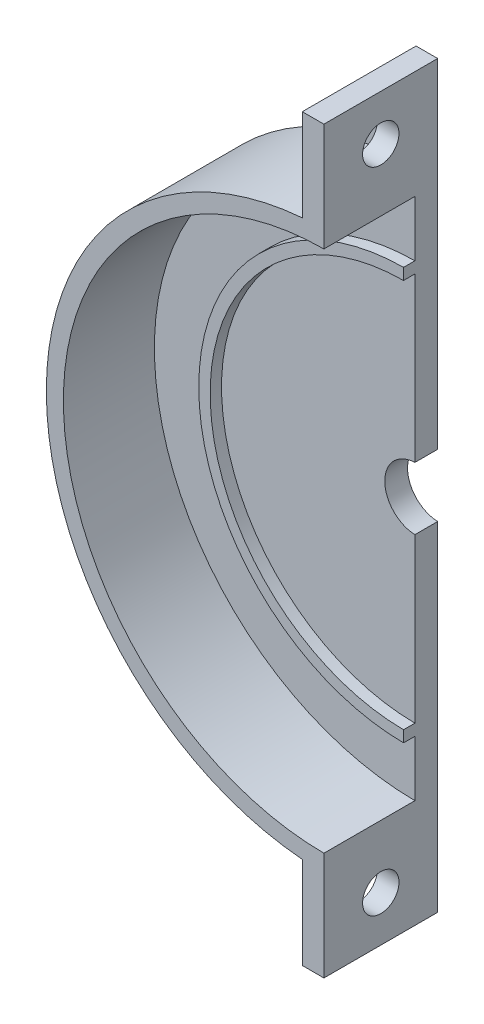
ISO-10303-21;
HEADER;
FILE_DESCRIPTION(('STEP AP214'),'2;1');
FILE_NAME('part.step','',(''),(''),'','','');
FILE_SCHEMA(('AUTOMOTIVE_DESIGN { 1 0 10303 214 1 1 1 1 }'));
ENDSEC;
DATA;
#1=APPLICATION_CONTEXT('core data for automotive mechanical design processes');
#2=APPLICATION_PROTOCOL_DEFINITION('international standard','automotive_design',2000,#1);
#3=PRODUCT_CONTEXT('',#1,'mechanical');
#4=PRODUCT('Part','Part','',(#3));
#5=PRODUCT_RELATED_PRODUCT_CATEGORY('part','',(#4));
#6=PRODUCT_DEFINITION_FORMATION('','',#4);
#7=PRODUCT_DEFINITION_CONTEXT('part definition',#1,'design');
#8=PRODUCT_DEFINITION('design','',#6,#7);
#9=PRODUCT_DEFINITION_SHAPE('','',#8);
#10=(LENGTH_UNIT() NAMED_UNIT(*) SI_UNIT(.MILLI.,.METRE.));
#11=(NAMED_UNIT(*) PLANE_ANGLE_UNIT() SI_UNIT($,.RADIAN.));
#12=(NAMED_UNIT(*) SI_UNIT($,.STERADIAN.) SOLID_ANGLE_UNIT());
#13=UNCERTAINTY_MEASURE_WITH_UNIT(LENGTH_MEASURE(1.E-05),#10,'distance_accuracy_value','');
#14=(GEOMETRIC_REPRESENTATION_CONTEXT(3) GLOBAL_UNCERTAINTY_ASSIGNED_CONTEXT((#13)) GLOBAL_UNIT_ASSIGNED_CONTEXT((#10,
#11,#12)) REPRESENTATION_CONTEXT('',''));
#15=CARTESIAN_POINT('',(0.,0.,0.));
#16=DIRECTION('',(0.,0.,1.));
#17=DIRECTION('',(1.,0.,0.));
#18=AXIS2_PLACEMENT_3D('',#15,#16,#17);
#19=CARTESIAN_POINT('',(0.,0.,2.));
#20=DIRECTION('',(0.,0.,1.));
#21=DIRECTION('',(1.,0.,0.));
#22=AXIS2_PLACEMENT_3D('',#19,#20,#21);
#23=PLANE('',#22);
#24=DIRECTION('',(0.,1.,0.));
#25=VECTOR('',#24,1.);
#26=CARTESIAN_POINT('',(-0.0999999999999945,23.,2.));
#27=LINE('',#26,#25);
#28=CARTESIAN_POINT('',(-0.1,2.74818121673226,2.));
#29=VERTEX_POINT('',#28);
#30=CARTESIAN_POINT('',(-0.0999999999999961,17.0997075998392,2.));
#31=VERTEX_POINT('',#30);
#32=EDGE_CURVE('E261',#29,#31,#27,.T.);
#33=ORIENTED_EDGE('',*,*,#32,.T.);
#34=CARTESIAN_POINT('',(0.,0.,2.));
#35=DIRECTION('',(0.,0.,-1.));
#36=DIRECTION('',(1.,0.,0.));
#37=AXIS2_PLACEMENT_3D('',#34,#35,#36);
#38=CIRCLE('',#37,17.1);
#39=CARTESIAN_POINT('',(-0.0999999999999961,-17.0997075998392,2.));
#40=VERTEX_POINT('',#39);
#41=EDGE_CURVE('E181',#40,#31,#38,.T.);
#42=ORIENTED_EDGE('',*,*,#41,.F.);
#43=DIRECTION('',(0.,1.,0.));
#44=VECTOR('',#43,1.);
#45=CARTESIAN_POINT('',(-0.1,-2.65,2.));
#46=LINE('',#45,#44);
#47=CARTESIAN_POINT('',(-0.1,-2.74818121673226,2.));
#48=VERTEX_POINT('',#47);
#49=EDGE_CURVE('E260',#40,#48,#46,.T.);
#50=ORIENTED_EDGE('',*,*,#49,.T.);
#51=CARTESIAN_POINT('',(0.,0.,2.));
#52=DIRECTION('',(0.,0.,1.));
#53=DIRECTION('',(1.,0.,0.));
#54=AXIS2_PLACEMENT_3D('',#51,#52,#53);
#55=CIRCLE('',#54,2.75);
#56=EDGE_CURVE('E275',#48,#29,#55,.F.);
#57=ORIENTED_EDGE('',*,*,#56,.T.);
#58=EDGE_LOOP('',(#33,#42,#50,#57));
#59=FACE_BOUND('',#58,.T.);
#60=ADVANCED_FACE('F40',(#59),#23,.T.);
#61=CARTESIAN_POINT('',(-0.0999999999999945,-22.9997826076683,2.));
#62=VERTEX_POINT('',#61);
#63=CARTESIAN_POINT('',(-0.0999999999999958,-18.099723754798,2.));
#64=VERTEX_POINT('',#63);
#65=EDGE_CURVE('E57',#62,#64,#46,.T.);
#66=ORIENTED_EDGE('',*,*,#65,.T.);
#67=CARTESIAN_POINT('',(0.,0.,2.));
#68=DIRECTION('',(0.,0.,1.));
#69=DIRECTION('',(1.,0.,0.));
#70=AXIS2_PLACEMENT_3D('',#67,#68,#69);
#71=CIRCLE('',#70,18.1);
#72=CARTESIAN_POINT('',(-0.0999999999999958,18.099723754798,2.));
#73=VERTEX_POINT('',#72);
#74=EDGE_CURVE('E61',#73,#64,#71,.T.);
#75=ORIENTED_EDGE('',*,*,#74,.F.);
#76=CARTESIAN_POINT('',(-0.0999999999999945,22.9997826076683,2.));
#77=VERTEX_POINT('',#76);
#78=EDGE_CURVE('E285',#73,#77,#27,.T.);
#79=ORIENTED_EDGE('',*,*,#78,.T.);
#80=CARTESIAN_POINT('',(0.,0.,2.));
#81=DIRECTION('',(0.,0.,1.));
#82=DIRECTION('',(1.,0.,0.));
#83=AXIS2_PLACEMENT_3D('',#80,#81,#82);
#84=CIRCLE('',#83,23.);
#85=EDGE_CURVE('E258',#77,#62,#84,.T.);
#86=ORIENTED_EDGE('',*,*,#85,.T.);
#87=EDGE_LOOP('',(#66,#75,#79,#86));
#88=FACE_BOUND('',#87,.T.);
#89=ADVANCED_FACE('F367',(#88),#23,.T.);
#90=CARTESIAN_POINT('',(0.,0.,10.));
#91=DIRECTION('',(0.,0.,-1.));
#92=DIRECTION('',(-1.,0.,0.));
#93=AXIS2_PLACEMENT_3D('',#90,#91,#92);
#94=CYLINDRICAL_SURFACE('',#93,24.5);
#95=DIRECTION('',(0.,0.,-1.));
#96=VECTOR('',#95,1.);
#97=CARTESIAN_POINT('',(-9.12404728203419,22.7376727304094,1.));
#98=LINE('',#97,#96);
#99=CARTESIAN_POINT('',(-9.12404728203419,22.7376727304094,1.));
#100=VERTEX_POINT('',#99);
#101=CARTESIAN_POINT('',(-9.12404728203419,22.7376727304094,0.));
#102=VERTEX_POINT('',#101);
#103=EDGE_CURVE('E193',#100,#102,#98,.T.);
#104=ORIENTED_EDGE('',*,*,#103,.T.);
#105=CARTESIAN_POINT('',(0.,0.,0.));
#106=DIRECTION('',(0.,0.,1.));
#107=DIRECTION('',(-1.,0.,0.));
#108=AXIS2_PLACEMENT_3D('',#105,#106,#107);
#109=CIRCLE('',#108,24.5);
#110=CARTESIAN_POINT('',(-9.12404728203419,-22.7376727304094,0.));
#111=VERTEX_POINT('',#110);
#112=EDGE_CURVE('E250',#102,#111,#109,.T.);
#113=ORIENTED_EDGE('',*,*,#112,.T.);
#114=DIRECTION('',(0.,0.,-1.));
#115=VECTOR('',#114,1.);
#116=CARTESIAN_POINT('',(-9.12404728203419,-22.7376727304094,1.));
#117=LINE('',#116,#115);
#118=CARTESIAN_POINT('',(-9.12404728203419,-22.7376727304094,0.999999999999999));
#119=VERTEX_POINT('',#118);
#120=EDGE_CURVE('E224',#119,#111,#117,.T.);
#121=ORIENTED_EDGE('',*,*,#120,.F.);
#122=CARTESIAN_POINT('',(0.,0.,0.999999999999999));
#123=DIRECTION('',(0.,0.,1.));
#124=DIRECTION('',(1.,0.,0.));
#125=AXIS2_PLACEMENT_3D('',#122,#123,#124);
#126=CIRCLE('',#125,24.5);
#127=CARTESIAN_POINT('',(-2.,-24.4182308941496,0.999999999999999));
#128=VERTEX_POINT('',#127);
#129=EDGE_CURVE('E229',#119,#128,#126,.T.);
#130=ORIENTED_EDGE('',*,*,#129,.T.);
#131=DIRECTION('',(0.,0.,-1.));
#132=VECTOR('',#131,1.);
#133=CARTESIAN_POINT('',(-2.,-24.4182308941496,10.));
#134=LINE('',#133,#132);
#135=CARTESIAN_POINT('',(-2.,-24.4182308941496,10.));
#136=VERTEX_POINT('',#135);
#137=EDGE_CURVE('E247',#128,#136,#134,.F.);
#138=ORIENTED_EDGE('',*,*,#137,.T.);
#139=CARTESIAN_POINT('',(0.,0.,10.));
#140=DIRECTION('',(0.,0.,1.));
#141=DIRECTION('',(-1.,0.,0.));
#142=AXIS2_PLACEMENT_3D('',#139,#140,#141);
#143=CIRCLE('',#142,24.5);
#144=CARTESIAN_POINT('',(-2.,24.4182308941496,10.));
#145=VERTEX_POINT('',#144);
#146=EDGE_CURVE('E251',#145,#136,#143,.T.);
#147=ORIENTED_EDGE('',*,*,#146,.F.);
#148=DIRECTION('',(0.,0.,-1.));
#149=VECTOR('',#148,1.);
#150=CARTESIAN_POINT('',(-2.,24.4182308941496,10.));
#151=LINE('',#150,#149);
#152=CARTESIAN_POINT('',(-2.,24.4182308941496,1.));
#153=VERTEX_POINT('',#152);
#154=EDGE_CURVE('E214',#153,#145,#151,.F.);
#155=ORIENTED_EDGE('',*,*,#154,.F.);
#156=CARTESIAN_POINT('',(0.,0.,0.999999999999999));
#157=DIRECTION('',(0.,0.,1.));
#158=DIRECTION('',(1.,0.,0.));
#159=AXIS2_PLACEMENT_3D('',#156,#157,#158);
#160=CIRCLE('',#159,24.5);
#161=EDGE_CURVE('E197',#153,#100,#160,.T.);
#162=ORIENTED_EDGE('',*,*,#161,.T.);
#163=EDGE_LOOP('',(#104,#113,#121,#130,#138,#147,#155,#162));
#164=FACE_BOUND('',#163,.T.);
#165=ADVANCED_FACE('F343',(#164),#94,.T.);
#166=CARTESIAN_POINT('',(0.,0.,2.));
#167=DIRECTION('',(0.,0.,-1.));
#168=DIRECTION('',(-1.,0.,0.));
#169=AXIS2_PLACEMENT_3D('',#166,#167,#168);
#170=CYLINDRICAL_SURFACE('',#169,2.75);
#171=CARTESIAN_POINT('',(0.,0.,0.));
#172=DIRECTION('',(0.,0.,1.));
#173=DIRECTION('',(1.,0.,0.));
#174=AXIS2_PLACEMENT_3D('',#171,#172,#173);
#175=CIRCLE('',#174,2.75);
#176=CARTESIAN_POINT('',(-0.1,-2.74818121673226,0.));
#177=VERTEX_POINT('',#176);
#178=CARTESIAN_POINT('',(-0.1,2.74818121673226,0.));
#179=VERTEX_POINT('',#178);
#180=EDGE_CURVE('E268',#177,#179,#175,.F.);
#181=ORIENTED_EDGE('',*,*,#180,.T.);
#182=DIRECTION('',(0.,0.,-1.));
#183=VECTOR('',#182,1.);
#184=CARTESIAN_POINT('',(-0.1,2.74818121673226,2.));
#185=LINE('',#184,#183);
#186=EDGE_CURVE('E12',#29,#179,#185,.T.);
#187=ORIENTED_EDGE('',*,*,#186,.F.);
#188=ORIENTED_EDGE('',*,*,#56,.F.);
#189=DIRECTION('',(0.,0.,-1.));
#190=VECTOR('',#189,1.);
#191=CARTESIAN_POINT('',(-0.1,-2.74818121673226,2.));
#192=LINE('',#191,#190);
#193=EDGE_CURVE('E49',#48,#177,#192,.T.);
#194=ORIENTED_EDGE('',*,*,#193,.T.);
#195=EDGE_LOOP('',(#181,#187,#188,#194));
#196=FACE_BOUND('',#195,.T.);
#197=ADVANCED_FACE('F308',(#196),#170,.F.);
#198=CARTESIAN_POINT('',(-0.0999999999999945,23.,2.));
#199=DIRECTION('',(-1.,0.,0.));
#200=DIRECTION('',(0.,-1.,0.));
#201=AXIS2_PLACEMENT_3D('',#198,#199,#200);
#202=PLANE('',#201);
#203=CARTESIAN_POINT('',(-0.0999999999999925,28.5,5.));
#204=DIRECTION('',(-1.,0.,0.));
#205=DIRECTION('',(0.,-1.,0.));
#206=AXIS2_PLACEMENT_3D('',#203,#204,#205);
#207=CIRCLE('',#206,1.6);
#208=CARTESIAN_POINT('',(-0.0999999999999929,26.9,5.));
#209=VERTEX_POINT('',#208);
#210=EDGE_CURVE('E44',#209,#209,#207,.T.);
#211=ORIENTED_EDGE('',*,*,#210,.T.);
#212=EDGE_LOOP('',(#211));
#213=FACE_BOUND('',#212,.T.);
#214=DIRECTION('',(0.,1.,0.));
#215=VECTOR('',#214,1.);
#216=CARTESIAN_POINT('',(-0.0999999999999945,23.,0.));
#217=LINE('',#216,#215);
#218=CARTESIAN_POINT('',(-0.0999999999999919,32.5,0.));
#219=VERTEX_POINT('',#218);
#220=EDGE_CURVE('E271',#179,#219,#217,.T.);
#221=ORIENTED_EDGE('',*,*,#220,.T.);
#222=DIRECTION('',(0.,0.,1.));
#223=VECTOR('',#222,1.);
#224=CARTESIAN_POINT('',(-0.0999999999999919,32.5,2.));
#225=LINE('',#224,#223);
#226=CARTESIAN_POINT('',(-0.0999999999999919,32.5,10.));
#227=VERTEX_POINT('',#226);
#228=EDGE_CURVE('E203',#219,#227,#225,.T.);
#229=ORIENTED_EDGE('',*,*,#228,.T.);
#230=DIRECTION('',(0.,1.,0.));
#231=VECTOR('',#230,1.);
#232=CARTESIAN_POINT('',(-0.100000000000001,0.,10.));
#233=LINE('',#232,#231);
#234=CARTESIAN_POINT('',(-0.0999999999999945,22.9997826076683,10.));
#235=VERTEX_POINT('',#234);
#236=EDGE_CURVE('E256',#235,#227,#233,.T.);
#237=ORIENTED_EDGE('',*,*,#236,.F.);
#238=DIRECTION('',(0.,0.,-1.));
#239=VECTOR('',#238,1.);
#240=CARTESIAN_POINT('',(-0.0999999999999945,22.9997826076683,10.));
#241=LINE('',#240,#239);
#242=EDGE_CURVE('E281',#235,#77,#241,.T.);
#243=ORIENTED_EDGE('',*,*,#242,.T.);
#244=ORIENTED_EDGE('',*,*,#78,.F.);
#245=DIRECTION('',(0.,0.,-1.));
#246=VECTOR('',#245,1.);
#247=CARTESIAN_POINT('',(-0.099999999999995,18.099723754798,3.));
#248=LINE('',#247,#246);
#249=CARTESIAN_POINT('',(-0.099999999999995,18.099723754798,3.));
#250=VERTEX_POINT('',#249);
#251=EDGE_CURVE('E165',#250,#73,#248,.T.);
#252=ORIENTED_EDGE('',*,*,#251,.F.);
#253=DIRECTION('',(0.,1.,0.));
#254=VECTOR('',#253,1.);
#255=CARTESIAN_POINT('',(-0.0999999999999961,17.0997075998392,3.));
#256=LINE('',#255,#254);
#257=CARTESIAN_POINT('',(-0.0999999999999961,17.0997075998392,3.));
#258=VERTEX_POINT('',#257);
#259=EDGE_CURVE('E159',#258,#250,#256,.T.);
#260=ORIENTED_EDGE('',*,*,#259,.F.);
#261=DIRECTION('',(0.,0.,-1.));
#262=VECTOR('',#261,1.);
#263=CARTESIAN_POINT('',(-0.0999999999999961,17.0997075998392,3.));
#264=LINE('',#263,#262);
#265=EDGE_CURVE('E162',#258,#31,#264,.T.);
#266=ORIENTED_EDGE('',*,*,#265,.T.);
#267=ORIENTED_EDGE('',*,*,#32,.F.);
#268=ORIENTED_EDGE('',*,*,#186,.T.);
#269=EDGE_LOOP('',(#221,#229,#237,#243,#244,#252,#260,#266,#267,#268));
#270=FACE_BOUND('',#269,.T.);
#271=ADVANCED_FACE('F42',(#213,#270),#202,.F.);
#272=CARTESIAN_POINT('',(-0.1,-2.65,2.));
#273=DIRECTION('',(-1.,0.,0.));
#274=DIRECTION('',(0.,-1.,0.));
#275=AXIS2_PLACEMENT_3D('',#272,#273,#274);
#276=PLANE('',#275);
#277=CARTESIAN_POINT('',(-0.0999999999999925,-28.5,5.));
#278=DIRECTION('',(-1.,0.,0.));
#279=DIRECTION('',(0.,-1.,0.));
#280=AXIS2_PLACEMENT_3D('',#277,#278,#279);
#281=CIRCLE('',#280,1.6);
#282=CARTESIAN_POINT('',(-0.099999999999992,-30.1,5.));
#283=VERTEX_POINT('',#282);
#284=EDGE_CURVE('E231',#283,#283,#281,.F.);
#285=ORIENTED_EDGE('',*,*,#284,.F.);
#286=EDGE_LOOP('',(#285));
#287=FACE_BOUND('',#286,.T.);
#288=DIRECTION('',(0.,1.,0.));
#289=VECTOR('',#288,1.);
#290=CARTESIAN_POINT('',(-0.1,-2.65,0.));
#291=LINE('',#290,#289);
#292=CARTESIAN_POINT('',(-0.0999999999999919,-32.5,0.));
#293=VERTEX_POINT('',#292);
#294=EDGE_CURVE('E273',#293,#177,#291,.T.);
#295=ORIENTED_EDGE('',*,*,#294,.T.);
#296=ORIENTED_EDGE('',*,*,#193,.F.);
#297=ORIENTED_EDGE('',*,*,#49,.F.);
#298=DIRECTION('',(0.,0.,-1.));
#299=VECTOR('',#298,1.);
#300=CARTESIAN_POINT('',(-0.0999999999999961,-17.0997075998392,3.));
#301=LINE('',#300,#299);
#302=CARTESIAN_POINT('',(-0.0999999999999961,-17.0997075998392,3.));
#303=VERTEX_POINT('',#302);
#304=EDGE_CURVE('E314',#303,#40,#301,.T.);
#305=ORIENTED_EDGE('',*,*,#304,.F.);
#306=DIRECTION('',(0.,1.,0.));
#307=VECTOR('',#306,1.);
#308=CARTESIAN_POINT('',(-0.0999999999999961,-17.0997075998392,3.));
#309=LINE('',#308,#307);
#310=CARTESIAN_POINT('',(-0.0999999999999958,-18.099723754798,3.));
#311=VERTEX_POINT('',#310);
#312=EDGE_CURVE('E174',#311,#303,#309,.T.);
#313=ORIENTED_EDGE('',*,*,#312,.F.);
#314=DIRECTION('',(0.,0.,-1.));
#315=VECTOR('',#314,1.);
#316=CARTESIAN_POINT('',(-0.0999999999999958,-18.099723754798,3.));
#317=LINE('',#316,#315);
#318=EDGE_CURVE('E186',#311,#64,#317,.T.);
#319=ORIENTED_EDGE('',*,*,#318,.T.);
#320=ORIENTED_EDGE('',*,*,#65,.F.);
#321=DIRECTION('',(0.,0.,-1.));
#322=VECTOR('',#321,1.);
#323=CARTESIAN_POINT('',(-0.0999999999999945,-22.9997826076683,10.));
#324=LINE('',#323,#322);
#325=CARTESIAN_POINT('',(-0.0999999999999945,-22.9997826076683,10.));
#326=VERTEX_POINT('',#325);
#327=EDGE_CURVE('E272',#326,#62,#324,.T.);
#328=ORIENTED_EDGE('',*,*,#327,.F.);
#329=DIRECTION('',(0.,1.,0.));
#330=VECTOR('',#329,1.);
#331=CARTESIAN_POINT('',(-0.100000000000001,0.,10.));
#332=LINE('',#331,#330);
#333=CARTESIAN_POINT('',(-0.0999999999999919,-32.5,10.));
#334=VERTEX_POINT('',#333);
#335=EDGE_CURVE('E253',#334,#326,#332,.T.);
#336=ORIENTED_EDGE('',*,*,#335,.F.);
#337=DIRECTION('',(0.,0.,1.));
#338=VECTOR('',#337,1.);
#339=CARTESIAN_POINT('',(-0.0999999999999919,-32.5,2.));
#340=LINE('',#339,#338);
#341=EDGE_CURVE('E246',#293,#334,#340,.T.);
#342=ORIENTED_EDGE('',*,*,#341,.F.);
#343=EDGE_LOOP('',(#295,#296,#297,#305,#313,#319,#320,#328,#336,#342));
#344=FACE_BOUND('',#343,.T.);
#345=ADVANCED_FACE('F297',(#287,#344),#276,.F.);
#346=CARTESIAN_POINT('',(0.,0.,0.));
#347=DIRECTION('',(0.,0.,1.));
#348=DIRECTION('',(1.,0.,0.));
#349=AXIS2_PLACEMENT_3D('',#346,#347,#348);
#350=PLANE('',#349);
#351=ORIENTED_EDGE('',*,*,#112,.F.);
#352=DIRECTION('',(-0.589479158227283,-0.807783586126664,0.));
#353=VECTOR('',#352,1.);
#354=CARTESIAN_POINT('',(-2.,32.5,0.));
#355=LINE('',#354,#353);
#356=CARTESIAN_POINT('',(-2.,32.5,0.));
#357=VERTEX_POINT('',#356);
#358=EDGE_CURVE('E182',#357,#102,#355,.T.);
#359=ORIENTED_EDGE('',*,*,#358,.F.);
#360=DIRECTION('',(1.,0.,0.));
#361=VECTOR('',#360,1.);
#362=CARTESIAN_POINT('',(0.,32.5,0.));
#363=LINE('',#362,#361);
#364=EDGE_CURVE('E200',#357,#219,#363,.T.);
#365=ORIENTED_EDGE('',*,*,#364,.T.);
#366=ORIENTED_EDGE('',*,*,#220,.F.);
#367=ORIENTED_EDGE('',*,*,#180,.F.);
#368=ORIENTED_EDGE('',*,*,#294,.F.);
#369=DIRECTION('',(1.,0.,0.));
#370=VECTOR('',#369,1.);
#371=CARTESIAN_POINT('',(0.,-32.5,0.));
#372=LINE('',#371,#370);
#373=CARTESIAN_POINT('',(-2.,-32.5,0.));
#374=VERTEX_POINT('',#373);
#375=EDGE_CURVE('E232',#374,#293,#372,.T.);
#376=ORIENTED_EDGE('',*,*,#375,.F.);
#377=DIRECTION('',(-0.589479158227283,0.807783586126664,0.));
#378=VECTOR('',#377,1.);
#379=CARTESIAN_POINT('',(-2.,-32.5,0.));
#380=LINE('',#379,#378);
#381=EDGE_CURVE('E217',#374,#111,#380,.T.);
#382=ORIENTED_EDGE('',*,*,#381,.T.);
#383=EDGE_LOOP('',(#351,#359,#365,#366,#367,#368,#376,#382));
#384=FACE_BOUND('',#383,.T.);
#385=ADVANCED_FACE('F300',(#384),#350,.F.);
#386=CARTESIAN_POINT('',(0.,0.,10.));
#387=DIRECTION('',(0.,0.,-1.));
#388=DIRECTION('',(-1.,0.,0.));
#389=AXIS2_PLACEMENT_3D('',#386,#387,#388);
#390=CYLINDRICAL_SURFACE('',#389,23.);
#391=ORIENTED_EDGE('',*,*,#85,.F.);
#392=ORIENTED_EDGE('',*,*,#242,.F.);
#393=CARTESIAN_POINT('',(0.,0.,10.));
#394=DIRECTION('',(0.,0.,-1.));
#395=DIRECTION('',(-1.,0.,0.));
#396=AXIS2_PLACEMENT_3D('',#393,#394,#395);
#397=CIRCLE('',#396,23.);
#398=EDGE_CURVE('E254',#326,#235,#397,.T.);
#399=ORIENTED_EDGE('',*,*,#398,.F.);
#400=ORIENTED_EDGE('',*,*,#327,.T.);
#401=EDGE_LOOP('',(#391,#392,#399,#400));
#402=FACE_BOUND('',#401,.T.);
#403=ADVANCED_FACE('F328',(#402),#390,.F.);
#404=CARTESIAN_POINT('',(0.,0.,10.));
#405=DIRECTION('',(0.,0.,-1.));
#406=DIRECTION('',(-1.,0.,0.));
#407=AXIS2_PLACEMENT_3D('',#404,#405,#406);
#408=PLANE('',#407);
#409=ORIENTED_EDGE('',*,*,#236,.T.);
#410=DIRECTION('',(1.,0.,0.));
#411=VECTOR('',#410,1.);
#412=CARTESIAN_POINT('',(0.,32.5,10.));
#413=LINE('',#412,#411);
#414=CARTESIAN_POINT('',(-2.,32.5,10.));
#415=VERTEX_POINT('',#414);
#416=EDGE_CURVE('E205',#415,#227,#413,.T.);
#417=ORIENTED_EDGE('',*,*,#416,.F.);
#418=DIRECTION('',(0.,1.,0.));
#419=VECTOR('',#418,1.);
#420=CARTESIAN_POINT('',(-2.,23.2084428476753,10.));
#421=LINE('',#420,#419);
#422=EDGE_CURVE('E204',#145,#415,#421,.T.);
#423=ORIENTED_EDGE('',*,*,#422,.F.);
#424=ORIENTED_EDGE('',*,*,#146,.T.);
#425=DIRECTION('',(0.,-1.,0.));
#426=VECTOR('',#425,1.);
#427=CARTESIAN_POINT('',(-2.,-23.2084428476753,10.));
#428=LINE('',#427,#426);
#429=CARTESIAN_POINT('',(-2.,-32.5,10.));
#430=VERTEX_POINT('',#429);
#431=EDGE_CURVE('E237',#136,#430,#428,.T.);
#432=ORIENTED_EDGE('',*,*,#431,.T.);
#433=DIRECTION('',(1.,0.,0.));
#434=VECTOR('',#433,1.);
#435=CARTESIAN_POINT('',(0.,-32.5,10.));
#436=LINE('',#435,#434);
#437=EDGE_CURVE('E236',#430,#334,#436,.T.);
#438=ORIENTED_EDGE('',*,*,#437,.T.);
#439=ORIENTED_EDGE('',*,*,#335,.T.);
#440=ORIENTED_EDGE('',*,*,#398,.T.);
#441=EDGE_LOOP('',(#409,#417,#423,#424,#432,#438,#439,#440));
#442=FACE_BOUND('',#441,.T.);
#443=ADVANCED_FACE('F332',(#442),#408,.F.);
#444=CARTESIAN_POINT('',(-2.,-23.2084428476753,0.));
#445=DIRECTION('',(-1.,0.,0.));
#446=DIRECTION('',(0.,-1.,0.));
#447=AXIS2_PLACEMENT_3D('',#444,#445,#446);
#448=PLANE('',#447);
#449=DIRECTION('',(0.,-1.,0.));
#450=VECTOR('',#449,1.);
#451=CARTESIAN_POINT('',(-2.,-22.7376727304094,1.));
#452=LINE('',#451,#450);
#453=CARTESIAN_POINT('',(-2.,-32.5,1.));
#454=VERTEX_POINT('',#453);
#455=EDGE_CURVE('E218',#128,#454,#452,.T.);
#456=ORIENTED_EDGE('',*,*,#455,.T.);
#457=DIRECTION('',(0.,0.,1.));
#458=VECTOR('',#457,1.);
#459=CARTESIAN_POINT('',(-2.,-32.5,0.));
#460=LINE('',#459,#458);
#461=EDGE_CURVE('E235',#454,#430,#460,.T.);
#462=ORIENTED_EDGE('',*,*,#461,.T.);
#463=ORIENTED_EDGE('',*,*,#431,.F.);
#464=ORIENTED_EDGE('',*,*,#137,.F.);
#465=EDGE_LOOP('',(#456,#462,#463,#464));
#466=FACE_BOUND('',#465,.T.);
#467=CARTESIAN_POINT('',(-2.,-28.5,5.));
#468=DIRECTION('',(-1.,0.,0.));
#469=DIRECTION('',(0.,-1.,0.));
#470=AXIS2_PLACEMENT_3D('',#467,#468,#469);
#471=CIRCLE('',#470,1.6);
#472=CARTESIAN_POINT('',(-2.,-30.1,5.));
#473=VERTEX_POINT('',#472);
#474=EDGE_CURVE('E240',#473,#473,#471,.T.);
#475=ORIENTED_EDGE('',*,*,#474,.F.);
#476=EDGE_LOOP('',(#475));
#477=FACE_BOUND('',#476,.T.);
#478=ADVANCED_FACE('F349',(#466,#477),#448,.T.);
#479=CARTESIAN_POINT('',(0.,-32.5,0.));
#480=DIRECTION('',(0.,-1.,0.));
#481=DIRECTION('',(0.,0.,-1.));
#482=AXIS2_PLACEMENT_3D('',#479,#480,#481);
#483=PLANE('',#482);
#484=ORIENTED_EDGE('',*,*,#437,.F.);
#485=ORIENTED_EDGE('',*,*,#461,.F.);
#486=EDGE_CURVE('E243',#374,#454,#460,.T.);
#487=ORIENTED_EDGE('',*,*,#486,.F.);
#488=ORIENTED_EDGE('',*,*,#375,.T.);
#489=ORIENTED_EDGE('',*,*,#341,.T.);
#490=EDGE_LOOP('',(#484,#485,#487,#488,#489));
#491=FACE_BOUND('',#490,.T.);
#492=ADVANCED_FACE('F336',(#491),#483,.T.);
#493=CARTESIAN_POINT('',(-9.99999999999999,-28.5,5.));
#494=DIRECTION('',(1.,0.,0.));
#495=DIRECTION('',(0.,1.,0.));
#496=AXIS2_PLACEMENT_3D('',#493,#494,#495);
#497=CYLINDRICAL_SURFACE('',#496,1.6);
#498=ORIENTED_EDGE('',*,*,#474,.T.);
#499=EDGE_LOOP('',(#498));
#500=FACE_BOUND('',#499,.T.);
#501=ORIENTED_EDGE('',*,*,#284,.T.);
#502=EDGE_LOOP('',(#501));
#503=FACE_BOUND('',#502,.T.);
#504=ADVANCED_FACE('F295',(#500,#503),#497,.F.);
#505=CARTESIAN_POINT('',(0.,0.,1.));
#506=DIRECTION('',(0.,0.,1.));
#507=DIRECTION('',(1.,0.,0.));
#508=AXIS2_PLACEMENT_3D('',#505,#506,#507);
#509=PLANE('',#508);
#510=ORIENTED_EDGE('',*,*,#129,.F.);
#511=DIRECTION('',(-0.589479158227283,0.807783586126664,0.));
#512=VECTOR('',#511,1.);
#513=CARTESIAN_POINT('',(-2.,-32.5,1.));
#514=LINE('',#513,#512);
#515=EDGE_CURVE('E221',#454,#119,#514,.T.);
#516=ORIENTED_EDGE('',*,*,#515,.F.);
#517=ORIENTED_EDGE('',*,*,#455,.F.);
#518=EDGE_LOOP('',(#510,#516,#517));
#519=FACE_BOUND('',#518,.T.);
#520=ADVANCED_FACE('F347',(#519),#509,.T.);
#521=CARTESIAN_POINT('',(-2.,-32.5,1.));
#522=DIRECTION('',(-0.807783586126665,-0.589479158227283,0.));
#523=DIRECTION('',(0.589479158227283,-0.807783586126665,0.));
#524=AXIS2_PLACEMENT_3D('',#521,#522,#523);
#525=PLANE('',#524);
#526=ORIENTED_EDGE('',*,*,#381,.F.);
#527=ORIENTED_EDGE('',*,*,#486,.T.);
#528=ORIENTED_EDGE('',*,*,#515,.T.);
#529=ORIENTED_EDGE('',*,*,#120,.T.);
#530=EDGE_LOOP('',(#526,#527,#528,#529));
#531=FACE_BOUND('',#530,.T.);
#532=ADVANCED_FACE('F339',(#531),#525,.T.);
#533=CARTESIAN_POINT('',(-2.,23.2084428476753,0.));
#534=DIRECTION('',(1.,0.,0.));
#535=DIRECTION('',(0.,1.,0.));
#536=AXIS2_PLACEMENT_3D('',#533,#534,#535);
#537=PLANE('',#536);
#538=CARTESIAN_POINT('',(-2.,28.5,5.));
#539=DIRECTION('',(1.,0.,0.));
#540=DIRECTION('',(0.,1.,0.));
#541=AXIS2_PLACEMENT_3D('',#538,#539,#540);
#542=CIRCLE('',#541,1.6);
#543=CARTESIAN_POINT('',(-2.,30.1,5.));
#544=VERTEX_POINT('',#543);
#545=EDGE_CURVE('E208',#544,#544,#542,.F.);
#546=ORIENTED_EDGE('',*,*,#545,.F.);
#547=EDGE_LOOP('',(#546));
#548=FACE_BOUND('',#547,.T.);
#549=DIRECTION('',(0.,0.,1.));
#550=VECTOR('',#549,1.);
#551=CARTESIAN_POINT('',(-2.,32.5,0.));
#552=LINE('',#551,#550);
#553=CARTESIAN_POINT('',(-2.,32.5,1.));
#554=VERTEX_POINT('',#553);
#555=EDGE_CURVE('E215',#554,#415,#552,.T.);
#556=ORIENTED_EDGE('',*,*,#555,.F.);
#557=DIRECTION('',(0.,1.,0.));
#558=VECTOR('',#557,1.);
#559=CARTESIAN_POINT('',(-2.,22.7376727304094,1.));
#560=LINE('',#559,#558);
#561=EDGE_CURVE('E184',#153,#554,#560,.T.);
#562=ORIENTED_EDGE('',*,*,#561,.F.);
#563=ORIENTED_EDGE('',*,*,#154,.T.);
#564=ORIENTED_EDGE('',*,*,#422,.T.);
#565=EDGE_LOOP('',(#556,#562,#563,#564));
#566=FACE_BOUND('',#565,.T.);
#567=ADVANCED_FACE('F357',(#548,#566),#537,.F.);
#568=CARTESIAN_POINT('',(0.,32.5,0.));
#569=DIRECTION('',(0.,-1.,0.));
#570=DIRECTION('',(0.,0.,-1.));
#571=AXIS2_PLACEMENT_3D('',#568,#569,#570);
#572=PLANE('',#571);
#573=ORIENTED_EDGE('',*,*,#416,.T.);
#574=ORIENTED_EDGE('',*,*,#228,.F.);
#575=ORIENTED_EDGE('',*,*,#364,.F.);
#576=EDGE_CURVE('E211',#357,#554,#552,.T.);
#577=ORIENTED_EDGE('',*,*,#576,.T.);
#578=ORIENTED_EDGE('',*,*,#555,.T.);
#579=EDGE_LOOP('',(#573,#574,#575,#577,#578));
#580=FACE_BOUND('',#579,.T.);
#581=ADVANCED_FACE('F366',(#580),#572,.F.);
#582=CARTESIAN_POINT('',(-9.99999999999999,28.5,5.));
#583=DIRECTION('',(1.,0.,0.));
#584=DIRECTION('',(0.,1.,0.));
#585=AXIS2_PLACEMENT_3D('',#582,#583,#584);
#586=CYLINDRICAL_SURFACE('',#585,1.6);
#587=ORIENTED_EDGE('',*,*,#210,.F.);
#588=EDGE_LOOP('',(#587));
#589=FACE_BOUND('',#588,.T.);
#590=ORIENTED_EDGE('',*,*,#545,.T.);
#591=EDGE_LOOP('',(#590));
#592=FACE_BOUND('',#591,.T.);
#593=ADVANCED_FACE('F389',(#589,#592),#586,.F.);
#594=CARTESIAN_POINT('',(0.,0.,1.));
#595=DIRECTION('',(0.,0.,1.));
#596=DIRECTION('',(1.,0.,0.));
#597=AXIS2_PLACEMENT_3D('',#594,#595,#596);
#598=PLANE('',#597);
#599=ORIENTED_EDGE('',*,*,#161,.F.);
#600=ORIENTED_EDGE('',*,*,#561,.T.);
#601=DIRECTION('',(-0.589479158227283,-0.807783586126664,0.));
#602=VECTOR('',#601,1.);
#603=CARTESIAN_POINT('',(-2.,32.5,1.));
#604=LINE('',#603,#602);
#605=EDGE_CURVE('E192',#554,#100,#604,.T.);
#606=ORIENTED_EDGE('',*,*,#605,.T.);
#607=EDGE_LOOP('',(#599,#600,#606));
#608=FACE_BOUND('',#607,.T.);
#609=ADVANCED_FACE('F360',(#608),#598,.T.);
#610=CARTESIAN_POINT('',(-2.,32.5,1.));
#611=DIRECTION('',(0.807783586126665,-0.589479158227283,0.));
#612=DIRECTION('',(0.589479158227283,0.807783586126665,0.));
#613=AXIS2_PLACEMENT_3D('',#610,#611,#612);
#614=PLANE('',#613);
#615=ORIENTED_EDGE('',*,*,#358,.T.);
#616=ORIENTED_EDGE('',*,*,#103,.F.);
#617=ORIENTED_EDGE('',*,*,#605,.F.);
#618=ORIENTED_EDGE('',*,*,#576,.F.);
#619=EDGE_LOOP('',(#615,#616,#617,#618));
#620=FACE_BOUND('',#619,.T.);
#621=ADVANCED_FACE('F364',(#620),#614,.F.);
#622=CARTESIAN_POINT('',(0.,0.,3.));
#623=DIRECTION('',(0.,0.,-1.));
#624=DIRECTION('',(-1.,0.,0.));
#625=AXIS2_PLACEMENT_3D('',#622,#623,#624);
#626=CYLINDRICAL_SURFACE('',#625,17.1);
#627=ORIENTED_EDGE('',*,*,#41,.T.);
#628=ORIENTED_EDGE('',*,*,#265,.F.);
#629=CARTESIAN_POINT('',(0.,0.,3.));
#630=DIRECTION('',(0.,0.,-1.));
#631=DIRECTION('',(1.,0.,0.));
#632=AXIS2_PLACEMENT_3D('',#629,#630,#631);
#633=CIRCLE('',#632,17.1);
#634=EDGE_CURVE('E169',#303,#258,#633,.T.);
#635=ORIENTED_EDGE('',*,*,#634,.F.);
#636=ORIENTED_EDGE('',*,*,#304,.T.);
#637=EDGE_LOOP('',(#627,#628,#635,#636));
#638=FACE_BOUND('',#637,.T.);
#639=ADVANCED_FACE('F179',(#638),#626,.F.);
#640=CARTESIAN_POINT('',(0.,0.,3.));
#641=DIRECTION('',(0.,0.,-1.));
#642=DIRECTION('',(-1.,0.,0.));
#643=AXIS2_PLACEMENT_3D('',#640,#641,#642);
#644=CYLINDRICAL_SURFACE('',#643,18.1);
#645=ORIENTED_EDGE('',*,*,#74,.T.);
#646=ORIENTED_EDGE('',*,*,#318,.F.);
#647=CARTESIAN_POINT('',(0.,0.,3.));
#648=DIRECTION('',(0.,0.,1.));
#649=DIRECTION('',(1.,0.,0.));
#650=AXIS2_PLACEMENT_3D('',#647,#648,#649);
#651=CIRCLE('',#650,18.1);
#652=EDGE_CURVE('E168',#250,#311,#651,.T.);
#653=ORIENTED_EDGE('',*,*,#652,.F.);
#654=ORIENTED_EDGE('',*,*,#251,.T.);
#655=EDGE_LOOP('',(#645,#646,#653,#654));
#656=FACE_BOUND('',#655,.T.);
#657=ADVANCED_FACE('F323',(#656),#644,.T.);
#658=CARTESIAN_POINT('',(0.,0.,3.));
#659=DIRECTION('',(0.,0.,1.));
#660=DIRECTION('',(1.,0.,0.));
#661=AXIS2_PLACEMENT_3D('',#658,#659,#660);
#662=PLANE('',#661);
#663=ORIENTED_EDGE('',*,*,#634,.T.);
#664=ORIENTED_EDGE('',*,*,#259,.T.);
#665=ORIENTED_EDGE('',*,*,#652,.T.);
#666=ORIENTED_EDGE('',*,*,#312,.T.);
#667=EDGE_LOOP('',(#663,#664,#665,#666));
#668=FACE_BOUND('',#667,.T.);
#669=ADVANCED_FACE('F172',(#668),#662,.T.);
#670=CLOSED_SHELL('',(#60,#89,#165,#197,#271,#345,#385,#403,#443,#478,#492,#504,#520,#532,#567,
#581,#593,#609,#621,#639,#657,#669));
#671=MANIFOLD_SOLID_BREP('B2',#670);
#672=ADVANCED_BREP_SHAPE_REPRESENTATION('',(#18,#671),#14);
#673=SHAPE_DEFINITION_REPRESENTATION(#9,#672);
ENDSEC;
END-ISO-10303-21;
